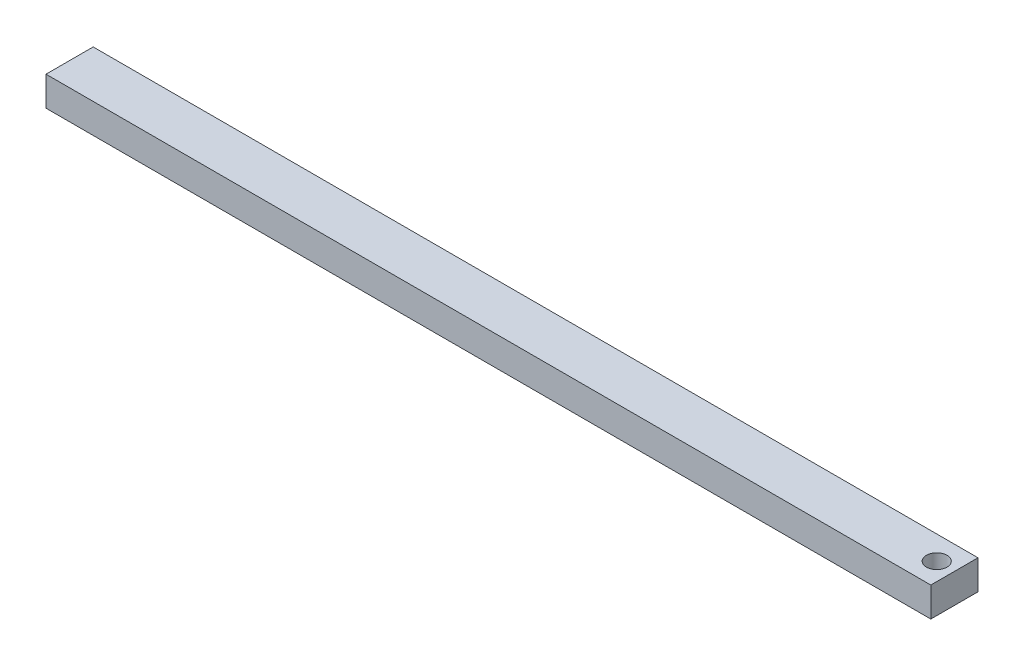
ISO-10303-21;
HEADER;
FILE_DESCRIPTION(('STEP AP214'),'2;1');
FILE_NAME('part.step','',(''),(''),'','','');
FILE_SCHEMA(('AUTOMOTIVE_DESIGN { 1 0 10303 214 1 1 1 1 }'));
ENDSEC;
DATA;
#1=APPLICATION_CONTEXT('core data for automotive mechanical design processes');
#2=APPLICATION_PROTOCOL_DEFINITION('international standard','automotive_design',2000,#1);
#3=PRODUCT_CONTEXT('',#1,'mechanical');
#4=PRODUCT('Part','Part','',(#3));
#5=PRODUCT_RELATED_PRODUCT_CATEGORY('part','',(#4));
#6=PRODUCT_DEFINITION_FORMATION('','',#4);
#7=PRODUCT_DEFINITION_CONTEXT('part definition',#1,'design');
#8=PRODUCT_DEFINITION('design','',#6,#7);
#9=PRODUCT_DEFINITION_SHAPE('','',#8);
#10=(LENGTH_UNIT() NAMED_UNIT(*) SI_UNIT(.MILLI.,.METRE.));
#11=(NAMED_UNIT(*) PLANE_ANGLE_UNIT() SI_UNIT($,.RADIAN.));
#12=(NAMED_UNIT(*) SI_UNIT($,.STERADIAN.) SOLID_ANGLE_UNIT());
#13=UNCERTAINTY_MEASURE_WITH_UNIT(LENGTH_MEASURE(1.E-05),#10,'distance_accuracy_value','');
#14=(GEOMETRIC_REPRESENTATION_CONTEXT(3) GLOBAL_UNCERTAINTY_ASSIGNED_CONTEXT((#13)) GLOBAL_UNIT_ASSIGNED_CONTEXT((#10,
#11,#12)) REPRESENTATION_CONTEXT('',''));
#15=CARTESIAN_POINT('',(0.,0.,0.));
#16=DIRECTION('',(0.,0.,1.));
#17=DIRECTION('',(1.,0.,0.));
#18=AXIS2_PLACEMENT_3D('',#15,#16,#17);
#19=CARTESIAN_POINT('',(-51.1538461538461,2.49999999999999,-8.));
#20=DIRECTION('',(-1.,0.,0.));
#21=DIRECTION('',(0.,0.,1.));
#22=AXIS2_PLACEMENT_3D('',#19,#20,#21);
#23=PLANE('',#22);
#24=DIRECTION('',(0.,-1.,0.));
#25=VECTOR('',#24,1.);
#26=CARTESIAN_POINT('',(-51.1538461538461,2.49999999999999,0.));
#27=LINE('',#26,#25);
#28=CARTESIAN_POINT('',(-51.1538461538461,2.49999999999999,0.));
#29=VERTEX_POINT('',#28);
#30=CARTESIAN_POINT('',(-51.1538461538461,-2.50000000000001,0.));
#31=VERTEX_POINT('',#30);
#32=EDGE_CURVE('E99',#29,#31,#27,.T.);
#33=ORIENTED_EDGE('',*,*,#32,.F.);
#34=DIRECTION('',(0.,0.,1.));
#35=VECTOR('',#34,1.);
#36=CARTESIAN_POINT('',(-51.1538461538461,2.49999999999999,-8.));
#37=LINE('',#36,#35);
#38=CARTESIAN_POINT('',(-51.1538461538461,2.49999999999999,-8.));
#39=VERTEX_POINT('',#38);
#40=EDGE_CURVE('E11',#39,#29,#37,.T.);
#41=ORIENTED_EDGE('',*,*,#40,.F.);
#42=DIRECTION('',(0.,-1.,0.));
#43=VECTOR('',#42,1.);
#44=CARTESIAN_POINT('',(-51.1538461538461,2.49999999999999,-8.));
#45=LINE('',#44,#43);
#46=CARTESIAN_POINT('',(-51.1538461538461,-2.50000000000001,-8.));
#47=VERTEX_POINT('',#46);
#48=EDGE_CURVE('E92',#39,#47,#45,.T.);
#49=ORIENTED_EDGE('',*,*,#48,.T.);
#50=DIRECTION('',(0.,0.,1.));
#51=VECTOR('',#50,1.);
#52=CARTESIAN_POINT('',(-51.1538461538461,-2.50000000000001,-8.));
#53=LINE('',#52,#51);
#54=EDGE_CURVE('E37',#47,#31,#53,.T.);
#55=ORIENTED_EDGE('',*,*,#54,.T.);
#56=EDGE_LOOP('',(#33,#41,#49,#55));
#57=FACE_BOUND('',#56,.T.);
#58=ADVANCED_FACE('F34',(#57),#23,.T.);
#59=CARTESIAN_POINT('',(-51.1538461538461,2.49999999999999,-8.));
#60=DIRECTION('',(0.,1.,0.));
#61=DIRECTION('',(0.,0.,1.));
#62=AXIS2_PLACEMENT_3D('',#59,#60,#61);
#63=PLANE('',#62);
#64=CARTESIAN_POINT('',(95.8461538461539,2.49999999999999,-4.));
#65=DIRECTION('',(0.,1.,0.));
#66=DIRECTION('',(0.,0.,1.));
#67=AXIS2_PLACEMENT_3D('',#64,#65,#66);
#68=CIRCLE('',#67,1.75);
#69=CARTESIAN_POINT('',(95.8461538461539,2.49999999999999,-2.25));
#70=VERTEX_POINT('',#69);
#71=EDGE_CURVE('E130',#70,#70,#68,.T.);
#72=ORIENTED_EDGE('',*,*,#71,.F.);
#73=EDGE_LOOP('',(#72));
#74=FACE_BOUND('',#73,.T.);
#75=DIRECTION('',(-1.,0.,0.));
#76=VECTOR('',#75,1.);
#77=CARTESIAN_POINT('',(-51.1538461538461,2.49999999999999,0.));
#78=LINE('',#77,#76);
#79=CARTESIAN_POINT('',(98.8461538461539,2.49999999999999,0.));
#80=VERTEX_POINT('',#79);
#81=EDGE_CURVE('E94',#80,#29,#78,.T.);
#82=ORIENTED_EDGE('',*,*,#81,.F.);
#83=DIRECTION('',(0.,0.,1.));
#84=VECTOR('',#83,1.);
#85=CARTESIAN_POINT('',(98.8461538461539,2.49999999999999,-8.));
#86=LINE('',#85,#84);
#87=CARTESIAN_POINT('',(98.8461538461539,2.49999999999999,-8.));
#88=VERTEX_POINT('',#87);
#89=EDGE_CURVE('E43',#88,#80,#86,.T.);
#90=ORIENTED_EDGE('',*,*,#89,.F.);
#91=DIRECTION('',(-1.,0.,0.));
#92=VECTOR('',#91,1.);
#93=CARTESIAN_POINT('',(-51.1538461538461,2.49999999999999,-8.));
#94=LINE('',#93,#92);
#95=EDGE_CURVE('E89',#88,#39,#94,.T.);
#96=ORIENTED_EDGE('',*,*,#95,.T.);
#97=ORIENTED_EDGE('',*,*,#40,.T.);
#98=EDGE_LOOP('',(#82,#90,#96,#97));
#99=FACE_BOUND('',#98,.T.);
#100=ADVANCED_FACE('F110',(#74,#99),#63,.T.);
#101=CARTESIAN_POINT('',(98.8461538461539,2.49999999999999,-8.));
#102=DIRECTION('',(1.,0.,0.));
#103=DIRECTION('',(0.,0.,-1.));
#104=AXIS2_PLACEMENT_3D('',#101,#102,#103);
#105=PLANE('',#104);
#106=DIRECTION('',(0.,1.,0.));
#107=VECTOR('',#106,1.);
#108=CARTESIAN_POINT('',(98.8461538461539,2.49999999999999,0.));
#109=LINE('',#108,#107);
#110=CARTESIAN_POINT('',(98.8461538461539,-2.50000000000001,0.));
#111=VERTEX_POINT('',#110);
#112=EDGE_CURVE('E84',#111,#80,#109,.T.);
#113=ORIENTED_EDGE('',*,*,#112,.F.);
#114=DIRECTION('',(0.,0.,1.));
#115=VECTOR('',#114,1.);
#116=CARTESIAN_POINT('',(98.8461538461539,-2.50000000000001,-8.));
#117=LINE('',#116,#115);
#118=CARTESIAN_POINT('',(98.8461538461539,-2.50000000000001,-8.));
#119=VERTEX_POINT('',#118);
#120=EDGE_CURVE('E79',#119,#111,#117,.T.);
#121=ORIENTED_EDGE('',*,*,#120,.F.);
#122=DIRECTION('',(0.,1.,0.));
#123=VECTOR('',#122,1.);
#124=CARTESIAN_POINT('',(98.8461538461539,2.49999999999999,-8.));
#125=LINE('',#124,#123);
#126=EDGE_CURVE('E82',#119,#88,#125,.T.);
#127=ORIENTED_EDGE('',*,*,#126,.T.);
#128=ORIENTED_EDGE('',*,*,#89,.T.);
#129=EDGE_LOOP('',(#113,#121,#127,#128));
#130=FACE_BOUND('',#129,.T.);
#131=ADVANCED_FACE('F81',(#130),#105,.T.);
#132=CARTESIAN_POINT('',(-51.1538461538461,-2.50000000000001,-8.));
#133=DIRECTION('',(0.,-1.,0.));
#134=DIRECTION('',(1.,0.,0.));
#135=AXIS2_PLACEMENT_3D('',#132,#133,#134);
#136=PLANE('',#135);
#137=CARTESIAN_POINT('',(95.8461538461539,-2.50000000000001,-4.));
#138=DIRECTION('',(0.,1.,0.));
#139=DIRECTION('',(0.,0.,1.));
#140=AXIS2_PLACEMENT_3D('',#137,#138,#139);
#141=CIRCLE('',#140,1.75);
#142=CARTESIAN_POINT('',(95.8461538461539,-2.50000000000001,-2.25));
#143=VERTEX_POINT('',#142);
#144=EDGE_CURVE('E103',#143,#143,#141,.T.);
#145=ORIENTED_EDGE('',*,*,#144,.T.);
#146=EDGE_LOOP('',(#145));
#147=FACE_BOUND('',#146,.T.);
#148=DIRECTION('',(1.,0.,0.));
#149=VECTOR('',#148,1.);
#150=CARTESIAN_POINT('',(-51.1538461538461,-2.50000000000001,0.));
#151=LINE('',#150,#149);
#152=EDGE_CURVE('E102',#31,#111,#151,.T.);
#153=ORIENTED_EDGE('',*,*,#152,.F.);
#154=ORIENTED_EDGE('',*,*,#54,.F.);
#155=DIRECTION('',(1.,0.,0.));
#156=VECTOR('',#155,1.);
#157=CARTESIAN_POINT('',(-51.1538461538461,-2.50000000000001,-8.));
#158=LINE('',#157,#156);
#159=EDGE_CURVE('E88',#47,#119,#158,.T.);
#160=ORIENTED_EDGE('',*,*,#159,.T.);
#161=ORIENTED_EDGE('',*,*,#120,.T.);
#162=EDGE_LOOP('',(#153,#154,#160,#161));
#163=FACE_BOUND('',#162,.T.);
#164=ADVANCED_FACE('F91',(#147,#163),#136,.T.);
#165=CARTESIAN_POINT('',(0.,0.,-8.));
#166=DIRECTION('',(0.,0.,1.));
#167=DIRECTION('',(1.,0.,0.));
#168=AXIS2_PLACEMENT_3D('',#165,#166,#167);
#169=PLANE('',#168);
#170=ORIENTED_EDGE('',*,*,#48,.F.);
#171=ORIENTED_EDGE('',*,*,#95,.F.);
#172=ORIENTED_EDGE('',*,*,#126,.F.);
#173=ORIENTED_EDGE('',*,*,#159,.F.);
#174=EDGE_LOOP('',(#170,#171,#172,#173));
#175=FACE_BOUND('',#174,.T.);
#176=ADVANCED_FACE('F87',(#175),#169,.F.);
#177=CARTESIAN_POINT('',(0.,0.,0.));
#178=DIRECTION('',(0.,0.,1.));
#179=DIRECTION('',(1.,0.,0.));
#180=AXIS2_PLACEMENT_3D('',#177,#178,#179);
#181=PLANE('',#180);
#182=ORIENTED_EDGE('',*,*,#32,.T.);
#183=ORIENTED_EDGE('',*,*,#152,.T.);
#184=ORIENTED_EDGE('',*,*,#112,.T.);
#185=ORIENTED_EDGE('',*,*,#81,.T.);
#186=EDGE_LOOP('',(#182,#183,#184,#185));
#187=FACE_BOUND('',#186,.T.);
#188=ADVANCED_FACE('F109',(#187),#181,.T.);
#189=CARTESIAN_POINT('',(95.8461538461539,-2.50000000000001,-4.));
#190=DIRECTION('',(0.,1.,0.));
#191=DIRECTION('',(0.,0.,1.));
#192=AXIS2_PLACEMENT_3D('',#189,#190,#191);
#193=CYLINDRICAL_SURFACE('',#192,1.75);
#194=ORIENTED_EDGE('',*,*,#144,.F.);
#195=EDGE_LOOP('',(#194));
#196=FACE_BOUND('',#195,.T.);
#197=ORIENTED_EDGE('',*,*,#71,.T.);
#198=EDGE_LOOP('',(#197));
#199=FACE_BOUND('',#198,.T.);
#200=ADVANCED_FACE('F134',(#196,#199),#193,.F.);
#201=CLOSED_SHELL('',(#58,#100,#131,#164,#176,#188,#200));
#202=MANIFOLD_SOLID_BREP('B2',#201);
#203=ADVANCED_BREP_SHAPE_REPRESENTATION('',(#18,#202),#14);
#204=SHAPE_DEFINITION_REPRESENTATION(#9,#203);
ENDSEC;
END-ISO-10303-21;
